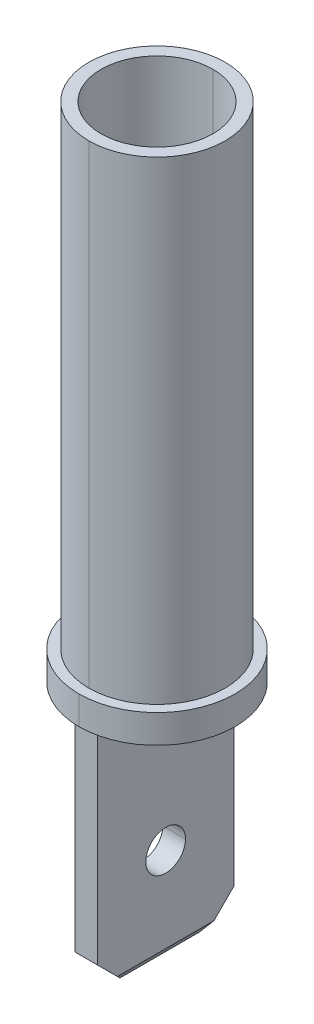
ISO-10303-21;
HEADER;
FILE_DESCRIPTION(('STEP AP214'),'2;1');
FILE_NAME('part.step','',(''),(''),'','','');
FILE_SCHEMA(('AUTOMOTIVE_DESIGN { 1 0 10303 214 1 1 1 1 }'));
ENDSEC;
DATA;
#1=APPLICATION_CONTEXT('core data for automotive mechanical design processes');
#2=APPLICATION_PROTOCOL_DEFINITION('international standard','automotive_design',2000,#1);
#3=PRODUCT_CONTEXT('',#1,'mechanical');
#4=PRODUCT('Part','Part','',(#3));
#5=PRODUCT_RELATED_PRODUCT_CATEGORY('part','',(#4));
#6=PRODUCT_DEFINITION_FORMATION('','',#4);
#7=PRODUCT_DEFINITION_CONTEXT('part definition',#1,'design');
#8=PRODUCT_DEFINITION('design','',#6,#7);
#9=PRODUCT_DEFINITION_SHAPE('','',#8);
#10=(LENGTH_UNIT() NAMED_UNIT(*) SI_UNIT(.MILLI.,.METRE.));
#11=(NAMED_UNIT(*) PLANE_ANGLE_UNIT() SI_UNIT($,.RADIAN.));
#12=(NAMED_UNIT(*) SI_UNIT($,.STERADIAN.) SOLID_ANGLE_UNIT());
#13=UNCERTAINTY_MEASURE_WITH_UNIT(LENGTH_MEASURE(1.E-05),#10,'distance_accuracy_value','');
#14=(GEOMETRIC_REPRESENTATION_CONTEXT(3) GLOBAL_UNCERTAINTY_ASSIGNED_CONTEXT((#13)) GLOBAL_UNIT_ASSIGNED_CONTEXT((#10,
#11,#12)) REPRESENTATION_CONTEXT('',''));
#15=CARTESIAN_POINT('',(0.,0.,0.));
#16=DIRECTION('',(0.,0.,1.));
#17=DIRECTION('',(1.,0.,0.));
#18=AXIS2_PLACEMENT_3D('',#15,#16,#17);
#19=CARTESIAN_POINT('',(0.,17.7,0.));
#20=DIRECTION('',(0.,-1.,0.));
#21=DIRECTION('',(0.,0.,-1.));
#22=AXIS2_PLACEMENT_3D('',#19,#20,#21);
#23=CYLINDRICAL_SURFACE('',#22,2.4);
#24=CARTESIAN_POINT('',(0.,17.7,0.));
#25=DIRECTION('',(0.,-1.,0.));
#26=DIRECTION('',(0.,0.,-1.));
#27=AXIS2_PLACEMENT_3D('',#24,#25,#26);
#28=CIRCLE('',#27,2.4);
#29=CARTESIAN_POINT('',(0.,17.7,-2.4));
#30=VERTEX_POINT('',#29);
#31=CARTESIAN_POINT('',(0.,17.7,2.4));
#32=VERTEX_POINT('',#31);
#33=EDGE_CURVE('E11',#30,#32,#28,.T.);
#34=ORIENTED_EDGE('',*,*,#33,.T.);
#35=DIRECTION('',(0.,-1.,0.));
#36=VECTOR('',#35,1.);
#37=CARTESIAN_POINT('',(0.,17.7,2.4));
#38=LINE('',#37,#36);
#39=CARTESIAN_POINT('',(0.,1.00000000074506,2.4));
#40=VERTEX_POINT('',#39);
#41=EDGE_CURVE('E27',#32,#40,#38,.T.);
#42=ORIENTED_EDGE('',*,*,#41,.T.);
#43=CARTESIAN_POINT('',(0.,1.00000000074506,0.));
#44=DIRECTION('',(0.,1.,0.));
#45=DIRECTION('',(0.,0.,-1.));
#46=AXIS2_PLACEMENT_3D('',#43,#44,#45);
#47=CIRCLE('',#46,2.4);
#48=CARTESIAN_POINT('',(0.,1.00000000074506,-2.4));
#49=VERTEX_POINT('',#48);
#50=EDGE_CURVE('E217',#40,#49,#47,.T.);
#51=ORIENTED_EDGE('',*,*,#50,.T.);
#52=DIRECTION('',(0.,-1.,0.));
#53=VECTOR('',#52,1.);
#54=CARTESIAN_POINT('',(0.,17.7,-2.4));
#55=LINE('',#54,#53);
#56=EDGE_CURVE('E206',#30,#49,#55,.T.);
#57=ORIENTED_EDGE('',*,*,#56,.F.);
#58=EDGE_LOOP('',(#34,#42,#51,#57));
#59=FACE_BOUND('',#58,.T.);
#60=ADVANCED_FACE('F16',(#59),#23,.T.);
#61=CARTESIAN_POINT('',(0.,17.7,0.));
#62=DIRECTION('',(0.,-1.,0.));
#63=DIRECTION('',(0.,0.,-1.));
#64=AXIS2_PLACEMENT_3D('',#61,#62,#63);
#65=CYLINDRICAL_SURFACE('',#64,1.97);
#66=CARTESIAN_POINT('',(0.,17.7,0.));
#67=DIRECTION('',(0.,-1.,0.));
#68=DIRECTION('',(0.,0.,-1.));
#69=AXIS2_PLACEMENT_3D('',#66,#67,#68);
#70=CIRCLE('',#69,1.97);
#71=CARTESIAN_POINT('',(0.,17.7,1.97));
#72=VERTEX_POINT('',#71);
#73=CARTESIAN_POINT('',(0.,17.7,-1.97));
#74=VERTEX_POINT('',#73);
#75=EDGE_CURVE('E231',#72,#74,#70,.T.);
#76=ORIENTED_EDGE('',*,*,#75,.F.);
#77=DIRECTION('',(0.,-1.,0.));
#78=VECTOR('',#77,1.);
#79=CARTESIAN_POINT('',(0.,17.7,1.97));
#80=LINE('',#79,#78);
#81=CARTESIAN_POINT('',(0.,2.,1.97));
#82=VERTEX_POINT('',#81);
#83=EDGE_CURVE('E220',#72,#82,#80,.T.);
#84=ORIENTED_EDGE('',*,*,#83,.T.);
#85=CARTESIAN_POINT('',(0.,2.,0.));
#86=DIRECTION('',(0.,1.,0.));
#87=DIRECTION('',(0.,0.,-1.));
#88=AXIS2_PLACEMENT_3D('',#85,#86,#87);
#89=CIRCLE('',#88,1.97);
#90=CARTESIAN_POINT('',(0.,2.,-1.97));
#91=VERTEX_POINT('',#90);
#92=EDGE_CURVE('E366',#91,#82,#89,.T.);
#93=ORIENTED_EDGE('',*,*,#92,.F.);
#94=DIRECTION('',(0.,-1.,0.));
#95=VECTOR('',#94,1.);
#96=CARTESIAN_POINT('',(0.,17.7,-1.97));
#97=LINE('',#96,#95);
#98=EDGE_CURVE('E60',#74,#91,#97,.T.);
#99=ORIENTED_EDGE('',*,*,#98,.F.);
#100=EDGE_LOOP('',(#76,#84,#93,#99));
#101=FACE_BOUND('',#100,.T.);
#102=ADVANCED_FACE('F853',(#101),#65,.F.);
#103=CARTESIAN_POINT('',(0.,1.,0.));
#104=DIRECTION('',(0.,-1.,0.));
#105=DIRECTION('',(0.,0.,-1.));
#106=AXIS2_PLACEMENT_3D('',#103,#104,#105);
#107=CYLINDRICAL_SURFACE('',#106,2.75);
#108=CARTESIAN_POINT('',(0.,1.,0.));
#109=DIRECTION('',(0.,1.,0.));
#110=DIRECTION('',(0.,0.,-1.));
#111=AXIS2_PLACEMENT_3D('',#108,#109,#110);
#112=CIRCLE('',#111,2.75);
#113=CARTESIAN_POINT('',(0.,1.,2.75));
#114=VERTEX_POINT('',#113);
#115=CARTESIAN_POINT('',(0.,1.,-2.75));
#116=VERTEX_POINT('',#115);
#117=EDGE_CURVE('E318',#114,#116,#112,.T.);
#118=ORIENTED_EDGE('',*,*,#117,.F.);
#119=DIRECTION('',(0.,-1.,0.));
#120=VECTOR('',#119,1.);
#121=CARTESIAN_POINT('',(0.,1.,2.75));
#122=LINE('',#121,#120);
#123=CARTESIAN_POINT('',(0.,0.,2.75));
#124=VERTEX_POINT('',#123);
#125=EDGE_CURVE('E298',#114,#124,#122,.T.);
#126=ORIENTED_EDGE('',*,*,#125,.T.);
#127=CARTESIAN_POINT('',(0.,0.,0.));
#128=DIRECTION('',(0.,1.,0.));
#129=DIRECTION('',(0.,0.,-1.));
#130=AXIS2_PLACEMENT_3D('',#127,#128,#129);
#131=CIRCLE('',#130,2.75);
#132=CARTESIAN_POINT('',(0.,0.,-2.75));
#133=VERTEX_POINT('',#132);
#134=EDGE_CURVE('E267',#124,#133,#131,.T.);
#135=ORIENTED_EDGE('',*,*,#134,.T.);
#136=DIRECTION('',(0.,-1.,0.));
#137=VECTOR('',#136,1.);
#138=CARTESIAN_POINT('',(0.,1.,-2.75));
#139=LINE('',#138,#137);
#140=EDGE_CURVE('E282',#116,#133,#139,.T.);
#141=ORIENTED_EDGE('',*,*,#140,.F.);
#142=EDGE_LOOP('',(#118,#126,#135,#141));
#143=FACE_BOUND('',#142,.T.);
#144=ADVANCED_FACE('F818',(#143),#107,.T.);
#145=CARTESIAN_POINT('',(0.,1.99999999999997,0.));
#146=DIRECTION('',(0.,1.,0.));
#147=DIRECTION('',(0.,0.,1.));
#148=AXIS2_PLACEMENT_3D('',#145,#146,#147);
#149=DEGENERATE_TOROIDAL_SURFACE('',#148,0.97,0.999999999999978,.T.);
#150=CARTESIAN_POINT('',(0.,1.,0.));
#151=DIRECTION('',(0.,-1.,0.));
#152=DIRECTION('',(0.,0.,1.));
#153=AXIS2_PLACEMENT_3D('',#150,#151,#152);
#154=CIRCLE('',#153,0.97);
#155=CARTESIAN_POINT('',(0.,1.,0.97));
#156=VERTEX_POINT('',#155);
#157=CARTESIAN_POINT('',(0.,1.,-0.97));
#158=VERTEX_POINT('',#157);
#159=EDGE_CURVE('E263',#156,#158,#154,.T.);
#160=ORIENTED_EDGE('',*,*,#159,.T.);
#161=CARTESIAN_POINT('',(0.,1.99999999999997,-0.97));
#162=DIRECTION('',(1.,0.,0.));
#163=DIRECTION('',(0.,0.,-1.));
#164=AXIS2_PLACEMENT_3D('',#161,#162,#163);
#165=CIRCLE('',#164,0.999999999999978);
#166=EDGE_CURVE('E268',#158,#91,#165,.T.);
#167=ORIENTED_EDGE('',*,*,#166,.T.);
#168=ORIENTED_EDGE('',*,*,#92,.T.);
#169=CARTESIAN_POINT('',(0.,1.99999999999997,0.97));
#170=DIRECTION('',(-1.,0.,0.));
#171=DIRECTION('',(0.,0.,1.));
#172=AXIS2_PLACEMENT_3D('',#169,#170,#171);
#173=CIRCLE('',#172,0.999999999999978);
#174=EDGE_CURVE('E269',#156,#82,#173,.T.);
#175=ORIENTED_EDGE('',*,*,#174,.F.);
#176=EDGE_LOOP('',(#160,#167,#168,#175));
#177=FACE_BOUND('',#176,.T.);
#178=ADVANCED_FACE('F786',(#177),#149,.F.);
#179=CARTESIAN_POINT('',(-2.751,-4.9,0.0957515419054487));
#180=DIRECTION('',(1.,0.,0.));
#181=DIRECTION('',(0.,0.,-1.));
#182=AXIS2_PLACEMENT_3D('',#179,#180,#181);
#183=CYLINDRICAL_SURFACE('',#182,0.7);
#184=CARTESIAN_POINT('',(-0.4,-4.9,0.0957515419054487));
#185=DIRECTION('',(-1.,0.,0.));
#186=DIRECTION('',(0.,0.,-1.));
#187=AXIS2_PLACEMENT_3D('',#184,#185,#186);
#188=CIRCLE('',#187,0.7);
#189=CARTESIAN_POINT('',(-0.4,-4.9,-0.604248458094551));
#190=VERTEX_POINT('',#189);
#191=CARTESIAN_POINT('',(-0.4,-4.9,0.795751541905449));
#192=VERTEX_POINT('',#191);
#193=EDGE_CURVE('E370',#190,#192,#188,.T.);
#194=ORIENTED_EDGE('',*,*,#193,.T.);
#195=DIRECTION('',(1.,0.,0.));
#196=VECTOR('',#195,1.);
#197=CARTESIAN_POINT('',(-2.751,-4.9,0.795751541905449));
#198=LINE('',#197,#196);
#199=CARTESIAN_POINT('',(0.4,-4.9,0.795751541905449));
#200=VERTEX_POINT('',#199);
#201=EDGE_CURVE('E293',#192,#200,#198,.T.);
#202=ORIENTED_EDGE('',*,*,#201,.T.);
#203=CARTESIAN_POINT('',(0.4,-4.9,0.0957515419054487));
#204=DIRECTION('',(1.,0.,0.));
#205=DIRECTION('',(0.,0.,-1.));
#206=AXIS2_PLACEMENT_3D('',#203,#204,#205);
#207=CIRCLE('',#206,0.7);
#208=CARTESIAN_POINT('',(0.4,-4.9,-0.604248458094551));
#209=VERTEX_POINT('',#208);
#210=EDGE_CURVE('E313',#200,#209,#207,.T.);
#211=ORIENTED_EDGE('',*,*,#210,.T.);
#212=DIRECTION('',(1.,0.,0.));
#213=VECTOR('',#212,1.);
#214=CARTESIAN_POINT('',(-2.751,-4.9,-0.604248458094551));
#215=LINE('',#214,#213);
#216=EDGE_CURVE('E241',#190,#209,#215,.T.);
#217=ORIENTED_EDGE('',*,*,#216,.F.);
#218=EDGE_LOOP('',(#194,#202,#211,#217));
#219=FACE_BOUND('',#218,.T.);
#220=ADVANCED_FACE('F782',(#219),#183,.F.);
#221=CARTESIAN_POINT('',(0.,17.7,0.));
#222=DIRECTION('',(0.,-1.,0.));
#223=DIRECTION('',(0.,0.,-1.));
#224=AXIS2_PLACEMENT_3D('',#221,#222,#223);
#225=CYLINDRICAL_SURFACE('',#224,2.4);
#226=ORIENTED_EDGE('',*,*,#41,.F.);
#227=CARTESIAN_POINT('',(0.,17.7,0.));
#228=DIRECTION('',(0.,-1.,0.));
#229=DIRECTION('',(0.,0.,-1.));
#230=AXIS2_PLACEMENT_3D('',#227,#228,#229);
#231=CIRCLE('',#230,2.4);
#232=EDGE_CURVE('E212',#32,#30,#231,.T.);
#233=ORIENTED_EDGE('',*,*,#232,.T.);
#234=ORIENTED_EDGE('',*,*,#56,.T.);
#235=CARTESIAN_POINT('',(0.,1.00000000074506,0.));
#236=DIRECTION('',(0.,1.,0.));
#237=DIRECTION('',(0.,0.,-1.));
#238=AXIS2_PLACEMENT_3D('',#235,#236,#237);
#239=CIRCLE('',#238,2.4);
#240=EDGE_CURVE('E210',#49,#40,#239,.T.);
#241=ORIENTED_EDGE('',*,*,#240,.T.);
#242=EDGE_LOOP('',(#226,#233,#234,#241));
#243=FACE_BOUND('',#242,.T.);
#244=ADVANCED_FACE('F208',(#243),#225,.T.);
#245=CARTESIAN_POINT('',(0.,17.7,0.));
#246=DIRECTION('',(0.,1.,0.));
#247=DIRECTION('',(1.,0.,0.));
#248=AXIS2_PLACEMENT_3D('',#245,#246,#247);
#249=PLANE('',#248);
#250=ORIENTED_EDGE('',*,*,#33,.F.);
#251=ORIENTED_EDGE('',*,*,#232,.F.);
#252=EDGE_LOOP('',(#250,#251));
#253=FACE_BOUND('',#252,.T.);
#254=CARTESIAN_POINT('',(0.,17.7,0.));
#255=DIRECTION('',(0.,-1.,0.));
#256=DIRECTION('',(0.,0.,-1.));
#257=AXIS2_PLACEMENT_3D('',#254,#255,#256);
#258=CIRCLE('',#257,1.97);
#259=EDGE_CURVE('E224',#74,#72,#258,.T.);
#260=ORIENTED_EDGE('',*,*,#259,.T.);
#261=ORIENTED_EDGE('',*,*,#75,.T.);
#262=EDGE_LOOP('',(#260,#261));
#263=FACE_BOUND('',#262,.T.);
#264=ADVANCED_FACE('F676',(#253,#263),#249,.T.);
#265=CARTESIAN_POINT('',(0.,1.,0.));
#266=DIRECTION('',(0.,1.,0.));
#267=DIRECTION('',(1.,0.,0.));
#268=AXIS2_PLACEMENT_3D('',#265,#266,#267);
#269=PLANE('',#268);
#270=CARTESIAN_POINT('',(0.,1.,0.));
#271=DIRECTION('',(0.,1.,0.));
#272=DIRECTION('',(0.,0.,-1.));
#273=AXIS2_PLACEMENT_3D('',#270,#271,#272);
#274=CIRCLE('',#273,2.75);
#275=EDGE_CURVE('E314',#116,#114,#274,.T.);
#276=ORIENTED_EDGE('',*,*,#275,.T.);
#277=ORIENTED_EDGE('',*,*,#117,.T.);
#278=EDGE_LOOP('',(#276,#277));
#279=FACE_BOUND('',#278,.T.);
#280=ORIENTED_EDGE('',*,*,#240,.F.);
#281=ORIENTED_EDGE('',*,*,#50,.F.);
#282=EDGE_LOOP('',(#280,#281));
#283=FACE_BOUND('',#282,.T.);
#284=ADVANCED_FACE('F222',(#279,#283),#269,.T.);
#285=CARTESIAN_POINT('',(0.,17.7,0.));
#286=DIRECTION('',(0.,-1.,0.));
#287=DIRECTION('',(0.,0.,-1.));
#288=AXIS2_PLACEMENT_3D('',#285,#286,#287);
#289=CYLINDRICAL_SURFACE('',#288,1.97);
#290=ORIENTED_EDGE('',*,*,#83,.F.);
#291=ORIENTED_EDGE('',*,*,#259,.F.);
#292=ORIENTED_EDGE('',*,*,#98,.T.);
#293=CARTESIAN_POINT('',(0.,2.,0.));
#294=DIRECTION('',(0.,1.,0.));
#295=DIRECTION('',(0.,0.,-1.));
#296=AXIS2_PLACEMENT_3D('',#293,#294,#295);
#297=CIRCLE('',#296,1.97);
#298=EDGE_CURVE('E272',#82,#91,#297,.T.);
#299=ORIENTED_EDGE('',*,*,#298,.F.);
#300=EDGE_LOOP('',(#290,#291,#292,#299));
#301=FACE_BOUND('',#300,.T.);
#302=ADVANCED_FACE('F668',(#301),#289,.F.);
#303=CARTESIAN_POINT('',(0.,1.,0.));
#304=DIRECTION('',(0.,-1.,0.));
#305=DIRECTION('',(0.,0.,-1.));
#306=AXIS2_PLACEMENT_3D('',#303,#304,#305);
#307=CYLINDRICAL_SURFACE('',#306,2.75);
#308=ORIENTED_EDGE('',*,*,#125,.F.);
#309=ORIENTED_EDGE('',*,*,#275,.F.);
#310=ORIENTED_EDGE('',*,*,#140,.T.);
#311=CARTESIAN_POINT('',(0.,0.,0.));
#312=DIRECTION('',(0.,1.,0.));
#313=DIRECTION('',(0.,0.,-1.));
#314=AXIS2_PLACEMENT_3D('',#311,#312,#313);
#315=CIRCLE('',#314,2.75);
#316=EDGE_CURVE('E275',#133,#124,#315,.T.);
#317=ORIENTED_EDGE('',*,*,#316,.T.);
#318=EDGE_LOOP('',(#308,#309,#310,#317));
#319=FACE_BOUND('',#318,.T.);
#320=ADVANCED_FACE('F664',(#319),#307,.T.);
#321=CARTESIAN_POINT('',(0.,1.99999999999997,0.));
#322=DIRECTION('',(0.,1.,0.));
#323=DIRECTION('',(0.,0.,1.));
#324=AXIS2_PLACEMENT_3D('',#321,#322,#323);
#325=DEGENERATE_TOROIDAL_SURFACE('',#324,0.97,0.999999999999978,.T.);
#326=ORIENTED_EDGE('',*,*,#166,.F.);
#327=CARTESIAN_POINT('',(0.,1.,0.));
#328=DIRECTION('',(0.,-1.,0.));
#329=DIRECTION('',(0.,0.,1.));
#330=AXIS2_PLACEMENT_3D('',#327,#328,#329);
#331=CIRCLE('',#330,0.97);
#332=EDGE_CURVE('E271',#158,#156,#331,.T.);
#333=ORIENTED_EDGE('',*,*,#332,.T.);
#334=ORIENTED_EDGE('',*,*,#174,.T.);
#335=ORIENTED_EDGE('',*,*,#298,.T.);
#336=EDGE_LOOP('',(#326,#333,#334,#335));
#337=FACE_BOUND('',#336,.T.);
#338=ADVANCED_FACE('F18',(#337),#325,.F.);
#339=CARTESIAN_POINT('',(0.,0.,0.));
#340=DIRECTION('',(0.,1.,0.));
#341=DIRECTION('',(1.,0.,0.));
#342=AXIS2_PLACEMENT_3D('',#339,#340,#341);
#343=PLANE('',#342);
#344=ORIENTED_EDGE('',*,*,#316,.F.);
#345=ORIENTED_EDGE('',*,*,#134,.F.);
#346=EDGE_LOOP('',(#344,#345));
#347=FACE_BOUND('',#346,.T.);
#348=DIRECTION('',(0.,0.,1.));
#349=VECTOR('',#348,1.);
#350=CARTESIAN_POINT('',(0.400000000248353,0.,0.));
#351=LINE('',#350,#349);
#352=CARTESIAN_POINT('',(0.400000000062089,0.,-2.3042484580233));
#353=VERTEX_POINT('',#352);
#354=CARTESIAN_POINT('',(0.400000000248353,0.,2.49575154170606));
#355=VERTEX_POINT('',#354);
#356=EDGE_CURVE('E193',#353,#355,#351,.T.);
#357=ORIENTED_EDGE('',*,*,#356,.F.);
#358=DIRECTION('',(-1.,0.,0.));
#359=VECTOR('',#358,1.);
#360=CARTESIAN_POINT('',(-0.4,0.,-2.30424845809455));
#361=LINE('',#360,#359);
#362=CARTESIAN_POINT('',(-0.400000000279397,0.,-2.30424845820081));
#363=VERTEX_POINT('',#362);
#364=EDGE_CURVE('E335',#353,#363,#361,.T.);
#365=ORIENTED_EDGE('',*,*,#364,.T.);
#366=DIRECTION('',(0.,0.,-1.));
#367=VECTOR('',#366,1.);
#368=CARTESIAN_POINT('',(-0.400000000372529,0.,0.));
#369=LINE('',#368,#367);
#370=CARTESIAN_POINT('',(-0.400000000093133,0.,2.49575154150667));
#371=VERTEX_POINT('',#370);
#372=EDGE_CURVE('E174',#371,#363,#369,.T.);
#373=ORIENTED_EDGE('',*,*,#372,.F.);
#374=DIRECTION('',(1.,0.,0.));
#375=VECTOR('',#374,1.);
#376=CARTESIAN_POINT('',(-0.4,0.,2.49575154190545));
#377=LINE('',#376,#375);
#378=EDGE_CURVE('E304',#371,#355,#377,.T.);
#379=ORIENTED_EDGE('',*,*,#378,.T.);
#380=EDGE_LOOP('',(#357,#365,#373,#379));
#381=FACE_BOUND('',#380,.T.);
#382=ADVANCED_FACE('F735',(#347,#381),#343,.F.);
#383=CARTESIAN_POINT('',(0.,1.,0.));
#384=DIRECTION('',(0.,1.,0.));
#385=DIRECTION('',(1.,0.,0.));
#386=AXIS2_PLACEMENT_3D('',#383,#384,#385);
#387=PLANE('',#386);
#388=ORIENTED_EDGE('',*,*,#159,.F.);
#389=ORIENTED_EDGE('',*,*,#332,.F.);
#390=EDGE_LOOP('',(#388,#389));
#391=FACE_BOUND('',#390,.T.);
#392=ADVANCED_FACE('F739',(#391),#387,.T.);
#393=CARTESIAN_POINT('',(0.4,-8.2,2.49575154190545));
#394=DIRECTION('',(-1.,0.,0.));
#395=DIRECTION('',(0.,0.,1.));
#396=AXIS2_PLACEMENT_3D('',#393,#394,#395);
#397=PLANE('',#396);
#398=DIRECTION('',(0.,0.707106781186547,0.707106781186548));
#399=VECTOR('',#398,1.);
#400=CARTESIAN_POINT('',(0.4,-7.89999999925494,1.79575154265051));
#401=LINE('',#400,#399);
#402=CARTESIAN_POINT('',(0.400000000096055,-7.89999999956711,1.79575154246089));
#403=VERTEX_POINT('',#402);
#404=CARTESIAN_POINT('',(0.400000000093133,-7.2,2.49575154190545));
#405=VERTEX_POINT('',#404);
#406=EDGE_CURVE('E332',#403,#405,#401,.T.);
#407=ORIENTED_EDGE('',*,*,#406,.F.);
#408=DIRECTION('',(0.,0.,1.));
#409=VECTOR('',#408,1.);
#410=CARTESIAN_POINT('',(0.4,-7.89999999956223,2.49575154190545));
#411=LINE('',#410,#409);
#412=CARTESIAN_POINT('',(0.400000000048028,-7.89999999969214,-1.60424845820621));
#413=VERTEX_POINT('',#412);
#414=EDGE_CURVE('E354',#413,#403,#411,.T.);
#415=ORIENTED_EDGE('',*,*,#414,.F.);
#416=DIRECTION('',(0.,-0.707106780570773,0.707106781802322));
#417=VECTOR('',#416,1.);
#418=CARTESIAN_POINT('',(0.4,-7.2,-2.30424845883961));
#419=LINE('',#418,#417);
#420=CARTESIAN_POINT('',(0.4,-7.20000000008438,-2.30424845819643));
#421=VERTEX_POINT('',#420);
#422=EDGE_CURVE('E357',#421,#413,#419,.T.);
#423=ORIENTED_EDGE('',*,*,#422,.F.);
#424=DIRECTION('',(0.,-1.,0.));
#425=VECTOR('',#424,1.);
#426=CARTESIAN_POINT('',(0.4,-8.2,-2.30424845812955));
#427=LINE('',#426,#425);
#428=EDGE_CURVE('E262',#353,#421,#427,.T.);
#429=ORIENTED_EDGE('',*,*,#428,.F.);
#430=ORIENTED_EDGE('',*,*,#356,.T.);
#431=DIRECTION('',(0.,1.,0.));
#432=VECTOR('',#431,1.);
#433=CARTESIAN_POINT('',(0.4,-8.2,2.49575154190545));
#434=LINE('',#433,#432);
#435=EDGE_CURVE('E334',#405,#355,#434,.T.);
#436=ORIENTED_EDGE('',*,*,#435,.F.);
#437=EDGE_LOOP('',(#407,#415,#423,#429,#430,#436));
#438=FACE_BOUND('',#437,.T.);
#439=CARTESIAN_POINT('',(0.4,-4.9,0.0957515419054487));
#440=DIRECTION('',(1.,0.,0.));
#441=DIRECTION('',(0.,0.,-1.));
#442=AXIS2_PLACEMENT_3D('',#439,#440,#441);
#443=CIRCLE('',#442,0.7);
#444=EDGE_CURVE('E237',#209,#200,#443,.T.);
#445=ORIENTED_EDGE('',*,*,#444,.F.);
#446=ORIENTED_EDGE('',*,*,#210,.F.);
#447=EDGE_LOOP('',(#445,#446));
#448=FACE_BOUND('',#447,.T.);
#449=ADVANCED_FACE('F703',(#438,#448),#397,.F.);
#450=CARTESIAN_POINT('',(-0.4,-8.2,2.49575154190545));
#451=DIRECTION('',(1.,0.,0.));
#452=DIRECTION('',(0.,1.,0.));
#453=AXIS2_PLACEMENT_3D('',#450,#451,#452);
#454=PLANE('',#453);
#455=DIRECTION('',(0.,0.707106780433923,-0.707106781939173));
#456=VECTOR('',#455,1.);
#457=CARTESIAN_POINT('',(-0.4,-7.89999999956632,-1.60424845778317));
#458=LINE('',#457,#456);
#459=CARTESIAN_POINT('',(-0.400000000302383,-7.89999999953464,-1.6042484579885));
#460=VERTEX_POINT('',#459);
#461=CARTESIAN_POINT('',(-0.400000000271818,-7.19999999981373,-2.30424845846708));
#462=VERTEX_POINT('',#461);
#463=EDGE_CURVE('E257',#460,#462,#458,.T.);
#464=ORIENTED_EDGE('',*,*,#463,.F.);
#465=DIRECTION('',(0.,0.,-1.));
#466=VECTOR('',#465,1.);
#467=CARTESIAN_POINT('',(-0.4,-7.89999999941673,2.49575154190545));
#468=LINE('',#467,#466);
#469=CARTESIAN_POINT('',(-0.40000000010652,-7.89999999974041,1.79575154215873));
#470=VERTEX_POINT('',#469);
#471=EDGE_CURVE('E148',#470,#460,#468,.T.);
#472=ORIENTED_EDGE('',*,*,#471,.F.);
#473=DIRECTION('',(0.,-0.707106781186547,-0.707106781186548));
#474=VECTOR('',#473,1.);
#475=CARTESIAN_POINT('',(-0.4,-7.2,2.49575154190545));
#476=LINE('',#475,#474);
#477=CARTESIAN_POINT('',(-0.4,-7.20000000019939,2.49575154170606));
#478=VERTEX_POINT('',#477);
#479=EDGE_CURVE('E307',#478,#470,#476,.T.);
#480=ORIENTED_EDGE('',*,*,#479,.F.);
#481=DIRECTION('',(0.,-1.,0.));
#482=VECTOR('',#481,1.);
#483=CARTESIAN_POINT('',(-0.4,-8.2,2.49575154110789));
#484=LINE('',#483,#482);
#485=EDGE_CURVE('E242',#371,#478,#484,.T.);
#486=ORIENTED_EDGE('',*,*,#485,.F.);
#487=ORIENTED_EDGE('',*,*,#372,.T.);
#488=DIRECTION('',(0.,1.,0.));
#489=VECTOR('',#488,1.);
#490=CARTESIAN_POINT('',(-0.4,-8.2,-2.30424845883961));
#491=LINE('',#490,#489);
#492=EDGE_CURVE('E319',#462,#363,#491,.T.);
#493=ORIENTED_EDGE('',*,*,#492,.F.);
#494=EDGE_LOOP('',(#464,#472,#480,#486,#487,#493));
#495=FACE_BOUND('',#494,.T.);
#496=ORIENTED_EDGE('',*,*,#193,.F.);
#497=CARTESIAN_POINT('',(-0.4,-4.9,0.0957515419054487));
#498=DIRECTION('',(-1.,0.,0.));
#499=DIRECTION('',(0.,0.,-1.));
#500=AXIS2_PLACEMENT_3D('',#497,#498,#499);
#501=CIRCLE('',#500,0.7);
#502=EDGE_CURVE('E243',#192,#190,#501,.T.);
#503=ORIENTED_EDGE('',*,*,#502,.F.);
#504=EDGE_LOOP('',(#496,#503));
#505=FACE_BOUND('',#504,.T.);
#506=ADVANCED_FACE('F698',(#495,#505),#454,.F.);
#507=CARTESIAN_POINT('',(-2.751,-4.9,0.0957515419054487));
#508=DIRECTION('',(1.,0.,0.));
#509=DIRECTION('',(0.,0.,-1.));
#510=AXIS2_PLACEMENT_3D('',#507,#508,#509);
#511=CYLINDRICAL_SURFACE('',#510,0.7);
#512=ORIENTED_EDGE('',*,*,#201,.F.);
#513=ORIENTED_EDGE('',*,*,#502,.T.);
#514=ORIENTED_EDGE('',*,*,#216,.T.);
#515=ORIENTED_EDGE('',*,*,#444,.T.);
#516=EDGE_LOOP('',(#512,#513,#514,#515));
#517=FACE_BOUND('',#516,.T.);
#518=ADVANCED_FACE('F702',(#517),#511,.F.);
#519=CARTESIAN_POINT('',(-0.4,-8.2,2.49575154190545));
#520=DIRECTION('',(0.,0.,-1.));
#521=DIRECTION('',(0.,-1.,0.));
#522=AXIS2_PLACEMENT_3D('',#519,#520,#521);
#523=PLANE('',#522);
#524=ORIENTED_EDGE('',*,*,#485,.T.);
#525=DIRECTION('',(-1.,0.,0.));
#526=VECTOR('',#525,1.);
#527=CARTESIAN_POINT('',(-0.4,-7.2,2.49575154190545));
#528=LINE('',#527,#526);
#529=EDGE_CURVE('E310',#405,#478,#528,.T.);
#530=ORIENTED_EDGE('',*,*,#529,.F.);
#531=ORIENTED_EDGE('',*,*,#435,.T.);
#532=ORIENTED_EDGE('',*,*,#378,.F.);
#533=EDGE_LOOP('',(#524,#530,#531,#532));
#534=FACE_BOUND('',#533,.T.);
#535=ADVANCED_FACE('F830',(#534),#523,.F.);
#536=CARTESIAN_POINT('',(0.4,-8.2,1.49575154190545));
#537=DIRECTION('',(0.,-0.707106781186546,0.707106781186549));
#538=DIRECTION('',(-1.,0.,0.));
#539=AXIS2_PLACEMENT_3D('',#536,#537,#538);
#540=PLANE('',#539);
#541=ORIENTED_EDGE('',*,*,#406,.T.);
#542=ORIENTED_EDGE('',*,*,#529,.T.);
#543=ORIENTED_EDGE('',*,*,#479,.T.);
#544=DIRECTION('',(0.443712605459549,-0.633687274511767,-0.633687274511764));
#545=VECTOR('',#544,1.);
#546=CARTESIAN_POINT('',(-0.400000000462119,-7.89999999941673,1.79575154248872));
#547=LINE('',#546,#545);
#548=CARTESIAN_POINT('',(-0.189937738984123,-8.19999999993691,1.49575154227798));
#549=VERTEX_POINT('',#548);
#550=EDGE_CURVE('E235',#470,#549,#547,.T.);
#551=ORIENTED_EDGE('',*,*,#550,.T.);
#552=DIRECTION('',(-1.,0.,0.));
#553=VECTOR('',#552,1.);
#554=CARTESIAN_POINT('',(0.4,-8.2,1.49575154265051));
#555=LINE('',#554,#553);
#556=CARTESIAN_POINT('',(0.18993773829884,-8.20000000002442,1.49575154246425));
#557=VERTEX_POINT('',#556);
#558=EDGE_CURVE('E353',#557,#549,#555,.T.);
#559=ORIENTED_EDGE('',*,*,#558,.F.);
#560=DIRECTION('',(0.443712606189862,0.633687274256082,0.633687274256079));
#561=VECTOR('',#560,1.);
#562=CARTESIAN_POINT('',(0.189937738329173,-8.19999999962747,1.49575154227798));
#563=LINE('',#562,#561);
#564=EDGE_CURVE('E20',#557,#403,#563,.T.);
#565=ORIENTED_EDGE('',*,*,#564,.T.);
#566=EDGE_LOOP('',(#541,#542,#543,#551,#559,#565));
#567=FACE_BOUND('',#566,.T.);
#568=ADVANCED_FACE('F751',(#567),#540,.T.);
#569=CARTESIAN_POINT('',(0.18993773853709,-8.2,-2.30424845809455));
#570=DIRECTION('',(0.819152044288993,-0.573576436351044,0.));
#571=DIRECTION('',(0.,0.,-1.));
#572=AXIS2_PLACEMENT_3D('',#569,#570,#571);
#573=PLANE('',#572);
#574=ORIENTED_EDGE('',*,*,#564,.F.);
#575=DIRECTION('',(0.,0.,-1.));
#576=VECTOR('',#575,1.);
#577=CARTESIAN_POINT('',(0.189937738468687,-8.20000000009769,-2.30424845809455));
#578=LINE('',#577,#576);
#579=CARTESIAN_POINT('',(0.189937738364051,-8.20000000002442,-1.30424845809455));
#580=VERTEX_POINT('',#579);
#581=EDGE_CURVE('E247',#557,#580,#578,.T.);
#582=ORIENTED_EDGE('',*,*,#581,.T.);
#583=DIRECTION('',(0.443712606522206,0.63368727457104,-0.63368727370841));
#584=VECTOR('',#583,1.);
#585=CARTESIAN_POINT('',(0.189937738468687,-8.20000000009769,-1.30424845809455));
#586=LINE('',#585,#584);
#587=EDGE_CURVE('E251',#580,#413,#586,.T.);
#588=ORIENTED_EDGE('',*,*,#587,.T.);
#589=ORIENTED_EDGE('',*,*,#414,.T.);
#590=EDGE_LOOP('',(#574,#582,#588,#589));
#591=FACE_BOUND('',#590,.T.);
#592=ADVANCED_FACE('F715',(#591),#573,.T.);
#593=CARTESIAN_POINT('',(0.4,-8.2,-1.30424845809455));
#594=DIRECTION('',(0.,-0.707106781186546,-0.707106781186549));
#595=DIRECTION('',(0.,-0.707106781186549,0.707106781186546));
#596=AXIS2_PLACEMENT_3D('',#593,#594,#595);
#597=PLANE('',#596);
#598=ORIENTED_EDGE('',*,*,#422,.T.);
#599=ORIENTED_EDGE('',*,*,#587,.F.);
#600=DIRECTION('',(-1.,0.,0.));
#601=VECTOR('',#600,1.);
#602=CARTESIAN_POINT('',(0.4,-8.2,-1.30424845809455));
#603=LINE('',#602,#601);
#604=CARTESIAN_POINT('',(-0.189937738984123,-8.19999999993691,-1.30424845809455));
#605=VERTEX_POINT('',#604);
#606=EDGE_CURVE('E256',#580,#605,#603,.T.);
#607=ORIENTED_EDGE('',*,*,#606,.T.);
#608=DIRECTION('',(-0.443712605902055,0.633687274356844,-0.633687274356841));
#609=VECTOR('',#608,1.);
#610=CARTESIAN_POINT('',(-0.18993773907423,-8.2,-1.30424845809455));
#611=LINE('',#610,#609);
#612=EDGE_CURVE('E252',#605,#460,#611,.T.);
#613=ORIENTED_EDGE('',*,*,#612,.T.);
#614=ORIENTED_EDGE('',*,*,#463,.T.);
#615=DIRECTION('',(1.,0.,0.));
#616=VECTOR('',#615,1.);
#617=CARTESIAN_POINT('',(0.4,-7.19999999962747,-2.30424845846708));
#618=LINE('',#617,#616);
#619=EDGE_CURVE('E258',#462,#421,#618,.T.);
#620=ORIENTED_EDGE('',*,*,#619,.T.);
#621=EDGE_LOOP('',(#598,#599,#607,#613,#614,#620));
#622=FACE_BOUND('',#621,.T.);
#623=ADVANCED_FACE('F711',(#622),#597,.T.);
#624=CARTESIAN_POINT('',(-0.4,-8.2,-2.30424845809455));
#625=DIRECTION('',(0.,0.,1.));
#626=DIRECTION('',(1.,0.,0.));
#627=AXIS2_PLACEMENT_3D('',#624,#625,#626);
#628=PLANE('',#627);
#629=ORIENTED_EDGE('',*,*,#428,.T.);
#630=ORIENTED_EDGE('',*,*,#619,.F.);
#631=ORIENTED_EDGE('',*,*,#492,.T.);
#632=ORIENTED_EDGE('',*,*,#364,.F.);
#633=EDGE_LOOP('',(#629,#630,#631,#632));
#634=FACE_BOUND('',#633,.T.);
#635=ADVANCED_FACE('F655',(#634),#628,.F.);
#636=CARTESIAN_POINT('',(-0.189937738537087,-8.2,-2.30424845809455));
#637=DIRECTION('',(-0.819152044288994,-0.573576436351043,0.));
#638=DIRECTION('',(-0.573576436351043,0.819152044288994,0.));
#639=AXIS2_PLACEMENT_3D('',#636,#637,#638);
#640=PLANE('',#639);
#641=ORIENTED_EDGE('',*,*,#612,.F.);
#642=DIRECTION('',(0.,0.,1.));
#643=VECTOR('',#642,1.);
#644=CARTESIAN_POINT('',(-0.189937738713801,-8.19999999974763,-2.30424845809455));
#645=LINE('',#644,#643);
#646=EDGE_CURVE('E323',#605,#549,#645,.T.);
#647=ORIENTED_EDGE('',*,*,#646,.T.);
#648=ORIENTED_EDGE('',*,*,#550,.F.);
#649=ORIENTED_EDGE('',*,*,#471,.T.);
#650=EDGE_LOOP('',(#641,#647,#648,#649));
#651=FACE_BOUND('',#650,.T.);
#652=ADVANCED_FACE('F649',(#651),#640,.T.);
#653=CARTESIAN_POINT('',(0.4,-8.2,-2.30424845809455));
#654=DIRECTION('',(0.,-1.,0.));
#655=DIRECTION('',(0.,0.,-1.));
#656=AXIS2_PLACEMENT_3D('',#653,#654,#655);
#657=PLANE('',#656);
#658=ORIENTED_EDGE('',*,*,#606,.F.);
#659=ORIENTED_EDGE('',*,*,#581,.F.);
#660=ORIENTED_EDGE('',*,*,#558,.T.);
#661=ORIENTED_EDGE('',*,*,#646,.F.);
#662=EDGE_LOOP('',(#658,#659,#660,#661));
#663=FACE_BOUND('',#662,.T.);
#664=ADVANCED_FACE('F654',(#663),#657,.T.);
#665=CLOSED_SHELL('',(#60,#102,#144,#178,#220,#244,#264,#284,#302,#320,#338,#382,#392,#449,#506,
#518,#535,#568,#592,#623,#635,#652,#664));
#666=MANIFOLD_SOLID_BREP('B1',#665);
#667=ADVANCED_BREP_SHAPE_REPRESENTATION('',(#18,#666),#14);
#668=SHAPE_DEFINITION_REPRESENTATION(#9,#667);
ENDSEC;
END-ISO-10303-21;
